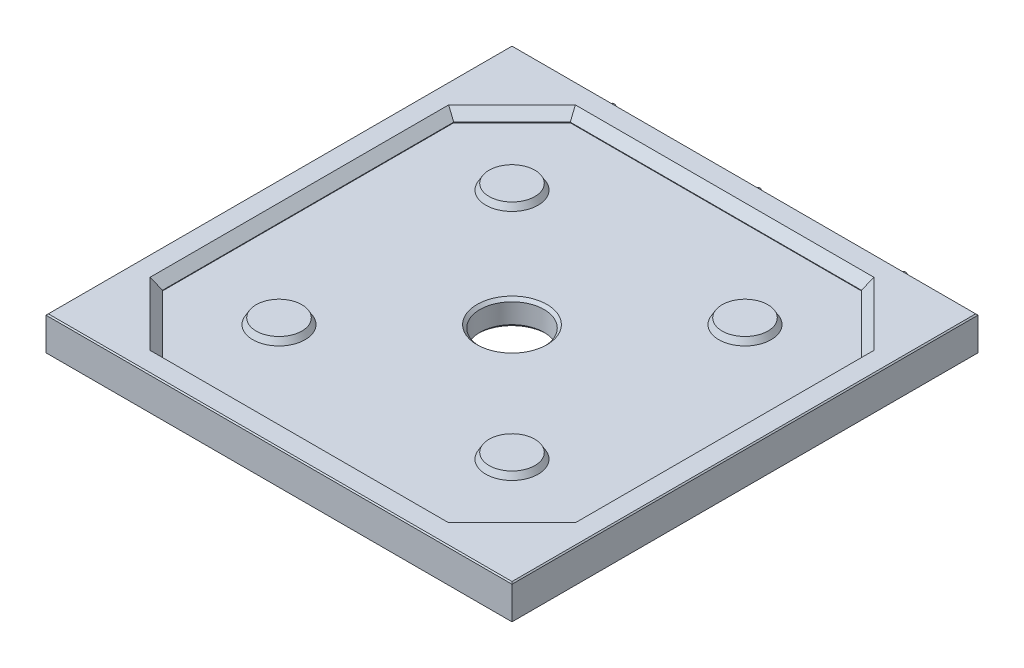
ISO-10303-21;
HEADER;
FILE_DESCRIPTION(('STEP AP214'),'2;1');
FILE_NAME('part.step','',(''),(''),'','','');
FILE_SCHEMA(('AUTOMOTIVE_DESIGN { 1 0 10303 214 1 1 1 1 }'));
ENDSEC;
DATA;
#1=APPLICATION_CONTEXT('core data for automotive mechanical design processes');
#2=APPLICATION_PROTOCOL_DEFINITION('international standard','automotive_design',2000,#1);
#3=PRODUCT_CONTEXT('',#1,'mechanical');
#4=PRODUCT('Part','Part','',(#3));
#5=PRODUCT_RELATED_PRODUCT_CATEGORY('part','',(#4));
#6=PRODUCT_DEFINITION_FORMATION('','',#4);
#7=PRODUCT_DEFINITION_CONTEXT('part definition',#1,'design');
#8=PRODUCT_DEFINITION('design','',#6,#7);
#9=PRODUCT_DEFINITION_SHAPE('','',#8);
#10=(LENGTH_UNIT() NAMED_UNIT(*) SI_UNIT(.MILLI.,.METRE.));
#11=(NAMED_UNIT(*) PLANE_ANGLE_UNIT() SI_UNIT($,.RADIAN.));
#12=(NAMED_UNIT(*) SI_UNIT($,.STERADIAN.) SOLID_ANGLE_UNIT());
#13=UNCERTAINTY_MEASURE_WITH_UNIT(LENGTH_MEASURE(1.E-05),#10,'distance_accuracy_value','');
#14=(GEOMETRIC_REPRESENTATION_CONTEXT(3) GLOBAL_UNCERTAINTY_ASSIGNED_CONTEXT((#13)) GLOBAL_UNIT_ASSIGNED_CONTEXT((#10,
#11,#12)) REPRESENTATION_CONTEXT('',''));
#15=CARTESIAN_POINT('',(0.,0.,0.));
#16=DIRECTION('',(0.,0.,1.));
#17=DIRECTION('',(1.,0.,0.));
#18=AXIS2_PLACEMENT_3D('',#15,#16,#17);
#19=CARTESIAN_POINT('',(-200.,54.,200.));
#20=DIRECTION('',(0.,1.,0.));
#21=DIRECTION('',(0.,0.,1.));
#22=AXIS2_PLACEMENT_3D('',#19,#20,#21);
#23=PLANE('',#22);
#24=CARTESIAN_POINT('',(-200.,54.,200.));
#25=DIRECTION('',(0.,-1.,0.));
#26=DIRECTION('',(0.,0.,-1.));
#27=AXIS2_PLACEMENT_3D('',#24,#25,#26);
#28=CIRCLE('',#27,39.2264973081037);
#29=CARTESIAN_POINT('',(-200.,54.,160.773502691896));
#30=VERTEX_POINT('',#29);
#31=EDGE_CURVE('E20',#30,#30,#28,.T.);
#32=ORIENTED_EDGE('',*,*,#31,.F.);
#33=EDGE_LOOP('',(#32));
#34=FACE_BOUND('',#33,.T.);
#35=ADVANCED_FACE('F17',(#34),#23,.T.);
#36=CARTESIAN_POINT('',(200.,54.,200.));
#37=DIRECTION('',(0.,1.,0.));
#38=DIRECTION('',(0.,0.,1.));
#39=AXIS2_PLACEMENT_3D('',#36,#37,#38);
#40=PLANE('',#39);
#41=CARTESIAN_POINT('',(200.,54.,200.));
#42=DIRECTION('',(0.,-1.,0.));
#43=DIRECTION('',(0.,0.,-1.));
#44=AXIS2_PLACEMENT_3D('',#41,#42,#43);
#45=CIRCLE('',#44,39.2264973081037);
#46=CARTESIAN_POINT('',(200.,54.,160.773502691896));
#47=VERTEX_POINT('',#46);
#48=EDGE_CURVE('E259',#47,#47,#45,.T.);
#49=ORIENTED_EDGE('',*,*,#48,.F.);
#50=EDGE_LOOP('',(#49));
#51=FACE_BOUND('',#50,.T.);
#52=ADVANCED_FACE('F270',(#51),#40,.T.);
#53=CARTESIAN_POINT('',(200.,54.,-200.));
#54=DIRECTION('',(0.,1.,0.));
#55=DIRECTION('',(0.,0.,1.));
#56=AXIS2_PLACEMENT_3D('',#53,#54,#55);
#57=PLANE('',#56);
#58=CARTESIAN_POINT('',(200.,54.,-200.));
#59=DIRECTION('',(0.,-1.,0.));
#60=DIRECTION('',(0.,0.,-1.));
#61=AXIS2_PLACEMENT_3D('',#58,#59,#60);
#62=CIRCLE('',#61,39.2264973081037);
#63=CARTESIAN_POINT('',(200.,54.,-239.226497308104));
#64=VERTEX_POINT('',#63);
#65=EDGE_CURVE('E257',#64,#64,#62,.T.);
#66=ORIENTED_EDGE('',*,*,#65,.F.);
#67=EDGE_LOOP('',(#66));
#68=FACE_BOUND('',#67,.T.);
#69=ADVANCED_FACE('F275',(#68),#57,.T.);
#70=CARTESIAN_POINT('',(-200.,54.,-200.));
#71=DIRECTION('',(0.,1.,0.));
#72=DIRECTION('',(0.,0.,1.));
#73=AXIS2_PLACEMENT_3D('',#70,#71,#72);
#74=PLANE('',#73);
#75=CARTESIAN_POINT('',(-200.,54.,-200.));
#76=DIRECTION('',(0.,-1.,0.));
#77=DIRECTION('',(0.,0.,-1.));
#78=AXIS2_PLACEMENT_3D('',#75,#76,#77);
#79=CIRCLE('',#78,39.2264973081037);
#80=CARTESIAN_POINT('',(-200.,54.,-239.226497308104));
#81=VERTEX_POINT('',#80);
#82=EDGE_CURVE('E163',#81,#81,#79,.T.);
#83=ORIENTED_EDGE('',*,*,#82,.F.);
#84=EDGE_LOOP('',(#83));
#85=FACE_BOUND('',#84,.T.);
#86=ADVANCED_FACE('F446',(#85),#74,.T.);
#87=CARTESIAN_POINT('',(-200.,44.,200.));
#88=DIRECTION('',(0.,-1.,0.));
#89=DIRECTION('',(0.,0.,-1.));
#90=AXIS2_PLACEMENT_3D('',#87,#88,#89);
#91=CONICAL_SURFACE('',#90,45.,0.523598775598298);
#92=ORIENTED_EDGE('',*,*,#31,.T.);
#93=EDGE_LOOP('',(#92));
#94=FACE_BOUND('',#93,.T.);
#95=CARTESIAN_POINT('',(-200.,44.,200.));
#96=DIRECTION('',(0.,-1.,0.));
#97=DIRECTION('',(0.,0.,-1.));
#98=AXIS2_PLACEMENT_3D('',#95,#96,#97);
#99=CIRCLE('',#98,45.);
#100=CARTESIAN_POINT('',(-200.,44.,155.));
#101=VERTEX_POINT('',#100);
#102=EDGE_CURVE('E251',#101,#101,#99,.F.);
#103=ORIENTED_EDGE('',*,*,#102,.T.);
#104=EDGE_LOOP('',(#103));
#105=FACE_BOUND('',#104,.T.);
#106=ADVANCED_FACE('F266',(#94,#105),#91,.T.);
#107=CARTESIAN_POINT('',(200.,44.,200.));
#108=DIRECTION('',(0.,-1.,0.));
#109=DIRECTION('',(0.,0.,-1.));
#110=AXIS2_PLACEMENT_3D('',#107,#108,#109);
#111=CONICAL_SURFACE('',#110,45.,0.5235987755983);
#112=ORIENTED_EDGE('',*,*,#48,.T.);
#113=EDGE_LOOP('',(#112));
#114=FACE_BOUND('',#113,.T.);
#115=CARTESIAN_POINT('',(200.,44.,200.));
#116=DIRECTION('',(0.,-1.,0.));
#117=DIRECTION('',(0.,0.,-1.));
#118=AXIS2_PLACEMENT_3D('',#115,#116,#117);
#119=CIRCLE('',#118,45.);
#120=CARTESIAN_POINT('',(200.,44.,155.));
#121=VERTEX_POINT('',#120);
#122=EDGE_CURVE('E248',#121,#121,#119,.F.);
#123=ORIENTED_EDGE('',*,*,#122,.T.);
#124=EDGE_LOOP('',(#123));
#125=FACE_BOUND('',#124,.T.);
#126=ADVANCED_FACE('F440',(#114,#125),#111,.T.);
#127=CARTESIAN_POINT('',(200.,44.,-200.));
#128=DIRECTION('',(0.,-1.,0.));
#129=DIRECTION('',(0.,0.,-1.));
#130=AXIS2_PLACEMENT_3D('',#127,#128,#129);
#131=CONICAL_SURFACE('',#130,45.,0.5235987755983);
#132=ORIENTED_EDGE('',*,*,#65,.T.);
#133=EDGE_LOOP('',(#132));
#134=FACE_BOUND('',#133,.T.);
#135=CARTESIAN_POINT('',(200.,44.,-200.));
#136=DIRECTION('',(0.,-1.,0.));
#137=DIRECTION('',(0.,0.,-1.));
#138=AXIS2_PLACEMENT_3D('',#135,#136,#137);
#139=CIRCLE('',#138,45.);
#140=CARTESIAN_POINT('',(200.,44.,-245.));
#141=VERTEX_POINT('',#140);
#142=EDGE_CURVE('E245',#141,#141,#139,.F.);
#143=ORIENTED_EDGE('',*,*,#142,.T.);
#144=EDGE_LOOP('',(#143));
#145=FACE_BOUND('',#144,.T.);
#146=ADVANCED_FACE('F436',(#134,#145),#131,.T.);
#147=CARTESIAN_POINT('',(-200.,44.,-200.));
#148=DIRECTION('',(0.,-1.,0.));
#149=DIRECTION('',(0.,0.,-1.));
#150=AXIS2_PLACEMENT_3D('',#147,#148,#149);
#151=CONICAL_SURFACE('',#150,45.,0.523598775598298);
#152=ORIENTED_EDGE('',*,*,#82,.T.);
#153=EDGE_LOOP('',(#152));
#154=FACE_BOUND('',#153,.T.);
#155=CARTESIAN_POINT('',(-200.,44.,-200.));
#156=DIRECTION('',(0.,-1.,0.));
#157=DIRECTION('',(0.,0.,-1.));
#158=AXIS2_PLACEMENT_3D('',#155,#156,#157);
#159=CIRCLE('',#158,45.);
#160=CARTESIAN_POINT('',(-200.,44.,-245.));
#161=VERTEX_POINT('',#160);
#162=EDGE_CURVE('E242',#161,#161,#159,.F.);
#163=ORIENTED_EDGE('',*,*,#162,.T.);
#164=EDGE_LOOP('',(#163));
#165=FACE_BOUND('',#164,.T.);
#166=ADVANCED_FACE('F433',(#154,#165),#151,.T.);
#167=CARTESIAN_POINT('',(-250.,44.,-350.));
#168=DIRECTION('',(0.,0.,-1.));
#169=DIRECTION('',(-1.,0.,0.));
#170=AXIS2_PLACEMENT_3D('',#167,#168,#169);
#171=PLANE('',#170);
#172=DIRECTION('',(1.,0.,0.));
#173=VECTOR('',#172,1.);
#174=CARTESIAN_POINT('',(-250.,45.,-350.));
#175=LINE('',#174,#173);
#176=CARTESIAN_POINT('',(250.,45.,-350.));
#177=VERTEX_POINT('',#176);
#178=CARTESIAN_POINT('',(-250.,45.,-350.));
#179=VERTEX_POINT('',#178);
#180=EDGE_CURVE('E152',#177,#179,#175,.F.);
#181=ORIENTED_EDGE('',*,*,#180,.T.);
#182=DIRECTION('',(0.,1.,0.));
#183=VECTOR('',#182,1.);
#184=CARTESIAN_POINT('',(-250.,44.,-350.));
#185=LINE('',#184,#183);
#186=CARTESIAN_POINT('',(-250.,44.,-350.));
#187=VERTEX_POINT('',#186);
#188=EDGE_CURVE('E174',#179,#187,#185,.F.);
#189=ORIENTED_EDGE('',*,*,#188,.T.);
#190=DIRECTION('',(1.,0.,0.));
#191=VECTOR('',#190,1.);
#192=CARTESIAN_POINT('',(-2.4980018054066E-13,44.,-350.));
#193=LINE('',#192,#191);
#194=CARTESIAN_POINT('',(250.,44.,-350.));
#195=VERTEX_POINT('',#194);
#196=EDGE_CURVE('E159',#187,#195,#193,.T.);
#197=ORIENTED_EDGE('',*,*,#196,.T.);
#198=DIRECTION('',(0.,1.,0.));
#199=VECTOR('',#198,1.);
#200=CARTESIAN_POINT('',(250.,44.,-350.));
#201=LINE('',#200,#199);
#202=EDGE_CURVE('E155',#195,#177,#201,.T.);
#203=ORIENTED_EDGE('',*,*,#202,.T.);
#204=EDGE_LOOP('',(#181,#189,#197,#203));
#205=FACE_BOUND('',#204,.T.);
#206=ADVANCED_FACE('F157',(#205),#171,.F.);
#207=CARTESIAN_POINT('',(250.,44.,-350.));
#208=DIRECTION('',(0.707106781186547,0.,-0.707106781186548));
#209=DIRECTION('',(-0.707106781186548,0.,-0.707106781186547));
#210=AXIS2_PLACEMENT_3D('',#207,#208,#209);
#211=PLANE('',#210);
#212=DIRECTION('',(-0.707106781186547,0.,-0.707106781186548));
#213=VECTOR('',#212,1.);
#214=CARTESIAN_POINT('',(350.,45.,-250.));
#215=LINE('',#214,#213);
#216=CARTESIAN_POINT('',(350.,45.,-250.));
#217=VERTEX_POINT('',#216);
#218=EDGE_CURVE('E166',#217,#177,#215,.T.);
#219=ORIENTED_EDGE('',*,*,#218,.T.);
#220=ORIENTED_EDGE('',*,*,#202,.F.);
#221=DIRECTION('',(0.707106781186547,0.,0.707106781186548));
#222=VECTOR('',#221,1.);
#223=CARTESIAN_POINT('',(250.,44.,-350.));
#224=LINE('',#223,#222);
#225=CARTESIAN_POINT('',(350.,44.,-250.));
#226=VERTEX_POINT('',#225);
#227=EDGE_CURVE('E758',#195,#226,#224,.T.);
#228=ORIENTED_EDGE('',*,*,#227,.T.);
#229=DIRECTION('',(0.,1.,0.));
#230=VECTOR('',#229,1.);
#231=CARTESIAN_POINT('',(350.,44.,-250.));
#232=LINE('',#231,#230);
#233=EDGE_CURVE('E162',#226,#217,#232,.T.);
#234=ORIENTED_EDGE('',*,*,#233,.T.);
#235=EDGE_LOOP('',(#219,#220,#228,#234));
#236=FACE_BOUND('',#235,.T.);
#237=ADVANCED_FACE('F168',(#236),#211,.F.);
#238=CARTESIAN_POINT('',(350.,44.,-250.));
#239=DIRECTION('',(1.,0.,0.));
#240=DIRECTION('',(0.,0.,-1.));
#241=AXIS2_PLACEMENT_3D('',#238,#239,#240);
#242=PLANE('',#241);
#243=DIRECTION('',(0.,0.,1.));
#244=VECTOR('',#243,1.);
#245=CARTESIAN_POINT('',(350.,45.,-250.));
#246=LINE('',#245,#244);
#247=CARTESIAN_POINT('',(350.,45.,250.));
#248=VERTEX_POINT('',#247);
#249=EDGE_CURVE('E696',#248,#217,#246,.F.);
#250=ORIENTED_EDGE('',*,*,#249,.T.);
#251=ORIENTED_EDGE('',*,*,#233,.F.);
#252=DIRECTION('',(0.,0.,-1.));
#253=VECTOR('',#252,1.);
#254=CARTESIAN_POINT('',(350.,44.,-600.));
#255=LINE('',#254,#253);
#256=CARTESIAN_POINT('',(350.,44.,250.));
#257=VERTEX_POINT('',#256);
#258=EDGE_CURVE('E756',#226,#257,#255,.F.);
#259=ORIENTED_EDGE('',*,*,#258,.T.);
#260=DIRECTION('',(0.,1.,0.));
#261=VECTOR('',#260,1.);
#262=CARTESIAN_POINT('',(350.,44.,250.));
#263=LINE('',#262,#261);
#264=EDGE_CURVE('E203',#257,#248,#263,.T.);
#265=ORIENTED_EDGE('',*,*,#264,.T.);
#266=EDGE_LOOP('',(#250,#251,#259,#265));
#267=FACE_BOUND('',#266,.T.);
#268=ADVANCED_FACE('F424',(#267),#242,.F.);
#269=CARTESIAN_POINT('',(250.,44.,350.));
#270=DIRECTION('',(0.707106781186548,0.,0.707106781186547));
#271=DIRECTION('',(0.707106781186547,0.,-0.707106781186548));
#272=AXIS2_PLACEMENT_3D('',#269,#270,#271);
#273=PLANE('',#272);
#274=DIRECTION('',(0.707106781186547,0.,-0.707106781186548));
#275=VECTOR('',#274,1.);
#276=CARTESIAN_POINT('',(250.,45.,350.));
#277=LINE('',#276,#275);
#278=CARTESIAN_POINT('',(250.,45.,350.));
#279=VERTEX_POINT('',#278);
#280=EDGE_CURVE('E711',#279,#248,#277,.T.);
#281=ORIENTED_EDGE('',*,*,#280,.T.);
#282=ORIENTED_EDGE('',*,*,#264,.F.);
#283=DIRECTION('',(-0.707106781186547,0.,0.707106781186548));
#284=VECTOR('',#283,1.);
#285=CARTESIAN_POINT('',(350.,44.,250.));
#286=LINE('',#285,#284);
#287=CARTESIAN_POINT('',(250.,44.,350.));
#288=VERTEX_POINT('',#287);
#289=EDGE_CURVE('E751',#257,#288,#286,.T.);
#290=ORIENTED_EDGE('',*,*,#289,.T.);
#291=DIRECTION('',(0.,1.,0.));
#292=VECTOR('',#291,1.);
#293=CARTESIAN_POINT('',(250.,44.,350.));
#294=LINE('',#293,#292);
#295=EDGE_CURVE('E201',#288,#279,#294,.T.);
#296=ORIENTED_EDGE('',*,*,#295,.T.);
#297=EDGE_LOOP('',(#281,#282,#290,#296));
#298=FACE_BOUND('',#297,.T.);
#299=ADVANCED_FACE('F420',(#298),#273,.F.);
#300=CARTESIAN_POINT('',(-250.,44.,350.));
#301=DIRECTION('',(0.,0.,1.));
#302=DIRECTION('',(1.,0.,0.));
#303=AXIS2_PLACEMENT_3D('',#300,#301,#302);
#304=PLANE('',#303);
#305=DIRECTION('',(1.,0.,0.));
#306=VECTOR('',#305,1.);
#307=CARTESIAN_POINT('',(-250.,45.,350.));
#308=LINE('',#307,#306);
#309=CARTESIAN_POINT('',(-250.,45.,350.));
#310=VERTEX_POINT('',#309);
#311=EDGE_CURVE('E716',#310,#279,#308,.T.);
#312=ORIENTED_EDGE('',*,*,#311,.T.);
#313=ORIENTED_EDGE('',*,*,#295,.F.);
#314=DIRECTION('',(1.,0.,0.));
#315=VECTOR('',#314,1.);
#316=CARTESIAN_POINT('',(-2.4980018054066E-13,44.,350.));
#317=LINE('',#316,#315);
#318=CARTESIAN_POINT('',(-250.,44.,350.));
#319=VERTEX_POINT('',#318);
#320=EDGE_CURVE('E747',#288,#319,#317,.F.);
#321=ORIENTED_EDGE('',*,*,#320,.T.);
#322=DIRECTION('',(0.,1.,0.));
#323=VECTOR('',#322,1.);
#324=CARTESIAN_POINT('',(-250.,44.,350.));
#325=LINE('',#324,#323);
#326=EDGE_CURVE('E199',#319,#310,#325,.T.);
#327=ORIENTED_EDGE('',*,*,#326,.T.);
#328=EDGE_LOOP('',(#312,#313,#321,#327));
#329=FACE_BOUND('',#328,.T.);
#330=ADVANCED_FACE('F416',(#329),#304,.F.);
#331=CARTESIAN_POINT('',(-350.,44.,250.));
#332=DIRECTION('',(-0.707106781186548,0.,0.707106781186548));
#333=DIRECTION('',(0.707106781186548,0.,0.707106781186548));
#334=AXIS2_PLACEMENT_3D('',#331,#332,#333);
#335=PLANE('',#334);
#336=DIRECTION('',(0.707106781186547,0.,0.707106781186547));
#337=VECTOR('',#336,1.);
#338=CARTESIAN_POINT('',(-350.,45.,250.));
#339=LINE('',#338,#337);
#340=CARTESIAN_POINT('',(-350.,45.,250.));
#341=VERTEX_POINT('',#340);
#342=EDGE_CURVE('E722',#341,#310,#339,.T.);
#343=ORIENTED_EDGE('',*,*,#342,.T.);
#344=ORIENTED_EDGE('',*,*,#326,.F.);
#345=DIRECTION('',(-0.707106781186547,0.,-0.707106781186547));
#346=VECTOR('',#345,1.);
#347=CARTESIAN_POINT('',(-250.,44.,350.));
#348=LINE('',#347,#346);
#349=CARTESIAN_POINT('',(-350.,44.,250.));
#350=VERTEX_POINT('',#349);
#351=EDGE_CURVE('E744',#319,#350,#348,.T.);
#352=ORIENTED_EDGE('',*,*,#351,.T.);
#353=DIRECTION('',(0.,1.,0.));
#354=VECTOR('',#353,1.);
#355=CARTESIAN_POINT('',(-350.,44.,250.));
#356=LINE('',#355,#354);
#357=EDGE_CURVE('E197',#350,#341,#356,.T.);
#358=ORIENTED_EDGE('',*,*,#357,.T.);
#359=EDGE_LOOP('',(#343,#344,#352,#358));
#360=FACE_BOUND('',#359,.T.);
#361=ADVANCED_FACE('F412',(#360),#335,.F.);
#362=CARTESIAN_POINT('',(-350.,44.,-250.));
#363=DIRECTION('',(-1.,0.,0.));
#364=DIRECTION('',(0.,0.,1.));
#365=AXIS2_PLACEMENT_3D('',#362,#363,#364);
#366=PLANE('',#365);
#367=DIRECTION('',(0.,0.,1.));
#368=VECTOR('',#367,1.);
#369=CARTESIAN_POINT('',(-350.,45.,-250.));
#370=LINE('',#369,#368);
#371=CARTESIAN_POINT('',(-350.,45.,-250.));
#372=VERTEX_POINT('',#371);
#373=EDGE_CURVE('E728',#372,#341,#370,.T.);
#374=ORIENTED_EDGE('',*,*,#373,.T.);
#375=ORIENTED_EDGE('',*,*,#357,.F.);
#376=DIRECTION('',(0.,0.,-1.));
#377=VECTOR('',#376,1.);
#378=CARTESIAN_POINT('',(-350.,44.,-600.));
#379=LINE('',#378,#377);
#380=CARTESIAN_POINT('',(-350.,44.,-250.));
#381=VERTEX_POINT('',#380);
#382=EDGE_CURVE('E746',#350,#381,#379,.T.);
#383=ORIENTED_EDGE('',*,*,#382,.T.);
#384=DIRECTION('',(0.,1.,0.));
#385=VECTOR('',#384,1.);
#386=CARTESIAN_POINT('',(-350.,44.,-250.));
#387=LINE('',#386,#385);
#388=EDGE_CURVE('E195',#381,#372,#387,.T.);
#389=ORIENTED_EDGE('',*,*,#388,.T.);
#390=EDGE_LOOP('',(#374,#375,#383,#389));
#391=FACE_BOUND('',#390,.T.);
#392=ADVANCED_FACE('F408',(#391),#366,.F.);
#393=CARTESIAN_POINT('',(-350.,44.,-250.));
#394=DIRECTION('',(-0.707106781186548,0.,-0.707106781186548));
#395=DIRECTION('',(-0.707106781186548,0.,0.707106781186548));
#396=AXIS2_PLACEMENT_3D('',#393,#394,#395);
#397=PLANE('',#396);
#398=DIRECTION('',(-0.707106781186548,0.,0.707106781186547));
#399=VECTOR('',#398,1.);
#400=CARTESIAN_POINT('',(-250.,45.,-350.));
#401=LINE('',#400,#399);
#402=EDGE_CURVE('E188',#179,#372,#401,.T.);
#403=ORIENTED_EDGE('',*,*,#402,.T.);
#404=ORIENTED_EDGE('',*,*,#388,.F.);
#405=DIRECTION('',(0.707106781186547,0.,-0.707106781186548));
#406=VECTOR('',#405,1.);
#407=CARTESIAN_POINT('',(-350.,44.,-250.));
#408=LINE('',#407,#406);
#409=EDGE_CURVE('E749',#381,#187,#408,.T.);
#410=ORIENTED_EDGE('',*,*,#409,.T.);
#411=ORIENTED_EDGE('',*,*,#188,.F.);
#412=EDGE_LOOP('',(#403,#404,#410,#411));
#413=FACE_BOUND('',#412,.T.);
#414=ADVANCED_FACE('F405',(#413),#397,.F.);
#415=CARTESIAN_POINT('',(250.,45.,-350.));
#416=DIRECTION('',(0.499999999999998,-0.707106781186551,-0.499999999999998));
#417=DIRECTION('',(0.,0.577350269189622,-0.816496580927728));
#418=AXIS2_PLACEMENT_3D('',#415,#416,#417);
#419=PLANE('',#418);
#420=ORIENTED_EDGE('',*,*,#218,.F.);
#421=DIRECTION('',(0.678598344545849,0.678598344545844,-0.281084637714822));
#422=VECTOR('',#421,1.);
#423=CARTESIAN_POINT('',(350.,45.,-250.));
#424=LINE('',#423,#422);
#425=CARTESIAN_POINT('',(365.,60.,-256.213203435596));
#426=VERTEX_POINT('',#425);
#427=EDGE_CURVE('E254',#217,#426,#424,.T.);
#428=ORIENTED_EDGE('',*,*,#427,.T.);
#429=DIRECTION('',(-0.707106781186547,0.,-0.707106781186548));
#430=VECTOR('',#429,1.);
#431=CARTESIAN_POINT('',(365.,60.,-256.213203435596));
#432=LINE('',#431,#430);
#433=CARTESIAN_POINT('',(256.213203435596,60.,-365.));
#434=VERTEX_POINT('',#433);
#435=EDGE_CURVE('E179',#426,#434,#432,.T.);
#436=ORIENTED_EDGE('',*,*,#435,.T.);
#437=DIRECTION('',(-0.281084637714822,-0.678598344545844,0.678598344545849));
#438=VECTOR('',#437,1.);
#439=CARTESIAN_POINT('',(256.213203435596,60.,-365.));
#440=LINE('',#439,#438);
#441=EDGE_CURVE('E173',#434,#177,#440,.T.);
#442=ORIENTED_EDGE('',*,*,#441,.T.);
#443=EDGE_LOOP('',(#420,#428,#436,#442));
#444=FACE_BOUND('',#443,.T.);
#445=ADVANCED_FACE('F177',(#444),#419,.F.);
#446=CARTESIAN_POINT('',(-250.,45.,-350.));
#447=DIRECTION('',(0.,-0.70710678118655,-0.707106781186545));
#448=DIRECTION('',(0.,0.707106781186545,-0.70710678118655));
#449=AXIS2_PLACEMENT_3D('',#446,#447,#448);
#450=PLANE('',#449);
#451=ORIENTED_EDGE('',*,*,#180,.F.);
#452=ORIENTED_EDGE('',*,*,#441,.F.);
#453=DIRECTION('',(1.,0.,0.));
#454=VECTOR('',#453,1.);
#455=CARTESIAN_POINT('',(-400.,60.,-365.));
#456=LINE('',#455,#454);
#457=CARTESIAN_POINT('',(-256.213203435597,60.,-365.));
#458=VERTEX_POINT('',#457);
#459=EDGE_CURVE('E783',#434,#458,#456,.F.);
#460=ORIENTED_EDGE('',*,*,#459,.T.);
#461=DIRECTION('',(0.281084637714827,-0.678598344545843,0.678598344545848));
#462=VECTOR('',#461,1.);
#463=CARTESIAN_POINT('',(-256.213203435597,60.,-365.));
#464=LINE('',#463,#462);
#465=EDGE_CURVE('E186',#458,#179,#464,.T.);
#466=ORIENTED_EDGE('',*,*,#465,.T.);
#467=EDGE_LOOP('',(#451,#452,#460,#466));
#468=FACE_BOUND('',#467,.T.);
#469=ADVANCED_FACE('F184',(#468),#450,.F.);
#470=CARTESIAN_POINT('',(-350.,45.,-250.));
#471=DIRECTION('',(-0.499999999999997,-0.707106781186552,-0.499999999999997));
#472=DIRECTION('',(0.,0.577350269189621,-0.816496580927729));
#473=AXIS2_PLACEMENT_3D('',#470,#471,#472);
#474=PLANE('',#473);
#475=DIRECTION('',(-0.707106781186548,0.,0.707106781186548));
#476=VECTOR('',#475,1.);
#477=CARTESIAN_POINT('',(-256.213203435597,60.,-365.));
#478=LINE('',#477,#476);
#479=CARTESIAN_POINT('',(-365.,60.,-256.213203435597));
#480=VERTEX_POINT('',#479);
#481=EDGE_CURVE('E781',#458,#480,#478,.T.);
#482=ORIENTED_EDGE('',*,*,#481,.T.);
#483=DIRECTION('',(0.678598344545847,-0.678598344545844,0.281084637714828));
#484=VECTOR('',#483,1.);
#485=CARTESIAN_POINT('',(-365.,60.,-256.213203435597));
#486=LINE('',#485,#484);
#487=EDGE_CURVE('E725',#480,#372,#486,.T.);
#488=ORIENTED_EDGE('',*,*,#487,.T.);
#489=ORIENTED_EDGE('',*,*,#402,.F.);
#490=ORIENTED_EDGE('',*,*,#465,.F.);
#491=EDGE_LOOP('',(#482,#488,#489,#490));
#492=FACE_BOUND('',#491,.T.);
#493=ADVANCED_FACE('F396',(#492),#474,.F.);
#494=CARTESIAN_POINT('',(-350.,45.,-250.));
#495=DIRECTION('',(-0.707106781186545,-0.70710678118655,0.));
#496=DIRECTION('',(0.70710678118655,-0.707106781186545,0.));
#497=AXIS2_PLACEMENT_3D('',#494,#495,#496);
#498=PLANE('',#497);
#499=DIRECTION('',(0.,0.,-1.));
#500=VECTOR('',#499,1.);
#501=CARTESIAN_POINT('',(-365.,60.,-400.));
#502=LINE('',#501,#500);
#503=CARTESIAN_POINT('',(-365.,60.,256.213203435596));
#504=VERTEX_POINT('',#503);
#505=EDGE_CURVE('E738',#480,#504,#502,.F.);
#506=ORIENTED_EDGE('',*,*,#505,.T.);
#507=DIRECTION('',(0.678598344545848,-0.678598344545845,-0.281084637714823));
#508=VECTOR('',#507,1.);
#509=CARTESIAN_POINT('',(-365.,60.,256.213203435596));
#510=LINE('',#509,#508);
#511=EDGE_CURVE('E719',#504,#341,#510,.T.);
#512=ORIENTED_EDGE('',*,*,#511,.T.);
#513=ORIENTED_EDGE('',*,*,#373,.F.);
#514=ORIENTED_EDGE('',*,*,#487,.F.);
#515=EDGE_LOOP('',(#506,#512,#513,#514));
#516=FACE_BOUND('',#515,.T.);
#517=ADVANCED_FACE('F392',(#516),#498,.F.);
#518=CARTESIAN_POINT('',(-350.,45.,250.));
#519=DIRECTION('',(-0.499999999999998,-0.707106781186551,0.499999999999998));
#520=DIRECTION('',(0.,-0.577350269189622,-0.816496580927728));
#521=AXIS2_PLACEMENT_3D('',#518,#519,#520);
#522=PLANE('',#521);
#523=DIRECTION('',(0.707106781186547,0.,0.707106781186547));
#524=VECTOR('',#523,1.);
#525=CARTESIAN_POINT('',(-365.,60.,256.213203435596));
#526=LINE('',#525,#524);
#527=CARTESIAN_POINT('',(-256.213203435597,60.,365.));
#528=VERTEX_POINT('',#527);
#529=EDGE_CURVE('E778',#504,#528,#526,.T.);
#530=ORIENTED_EDGE('',*,*,#529,.T.);
#531=DIRECTION('',(0.281084637714825,-0.678598344545844,-0.678598344545848));
#532=VECTOR('',#531,1.);
#533=CARTESIAN_POINT('',(-256.213203435597,60.,365.));
#534=LINE('',#533,#532);
#535=EDGE_CURVE('E713',#528,#310,#534,.T.);
#536=ORIENTED_EDGE('',*,*,#535,.T.);
#537=ORIENTED_EDGE('',*,*,#342,.F.);
#538=ORIENTED_EDGE('',*,*,#511,.F.);
#539=EDGE_LOOP('',(#530,#536,#537,#538));
#540=FACE_BOUND('',#539,.T.);
#541=ADVANCED_FACE('F388',(#540),#522,.F.);
#542=CARTESIAN_POINT('',(-250.,45.,350.));
#543=DIRECTION('',(0.,-0.707106781186549,0.707106781186546));
#544=DIRECTION('',(0.,-0.707106781186546,-0.707106781186549));
#545=AXIS2_PLACEMENT_3D('',#542,#543,#544);
#546=PLANE('',#545);
#547=DIRECTION('',(1.,0.,0.));
#548=VECTOR('',#547,1.);
#549=CARTESIAN_POINT('',(-400.,60.,365.));
#550=LINE('',#549,#548);
#551=CARTESIAN_POINT('',(256.213203435597,60.,365.));
#552=VERTEX_POINT('',#551);
#553=EDGE_CURVE('E771',#528,#552,#550,.T.);
#554=ORIENTED_EDGE('',*,*,#553,.T.);
#555=DIRECTION('',(-0.281084637714836,-0.678598344545843,-0.678598344545844));
#556=VECTOR('',#555,1.);
#557=CARTESIAN_POINT('',(256.213203435597,60.,365.));
#558=LINE('',#557,#556);
#559=EDGE_CURVE('E705',#552,#279,#558,.T.);
#560=ORIENTED_EDGE('',*,*,#559,.T.);
#561=ORIENTED_EDGE('',*,*,#311,.F.);
#562=ORIENTED_EDGE('',*,*,#535,.F.);
#563=EDGE_LOOP('',(#554,#560,#561,#562));
#564=FACE_BOUND('',#563,.T.);
#565=ADVANCED_FACE('F384',(#564),#546,.F.);
#566=CARTESIAN_POINT('',(250.,45.,350.));
#567=DIRECTION('',(0.499999999999995,-0.707106781186555,0.499999999999995));
#568=DIRECTION('',(0.816496580927731,0.577350269189618,0.));
#569=AXIS2_PLACEMENT_3D('',#566,#567,#568);
#570=PLANE('',#569);
#571=DIRECTION('',(0.707106781186547,0.,-0.707106781186548));
#572=VECTOR('',#571,1.);
#573=CARTESIAN_POINT('',(256.213203435597,60.,365.));
#574=LINE('',#573,#572);
#575=CARTESIAN_POINT('',(365.,60.,256.213203435597));
#576=VERTEX_POINT('',#575);
#577=EDGE_CURVE('E765',#552,#576,#574,.T.);
#578=ORIENTED_EDGE('',*,*,#577,.T.);
#579=DIRECTION('',(-0.678598344545847,-0.678598344545842,-0.281084637714832));
#580=VECTOR('',#579,1.);
#581=CARTESIAN_POINT('',(365.,60.,256.213203435597));
#582=LINE('',#581,#580);
#583=EDGE_CURVE('E701',#576,#248,#582,.T.);
#584=ORIENTED_EDGE('',*,*,#583,.T.);
#585=ORIENTED_EDGE('',*,*,#280,.F.);
#586=ORIENTED_EDGE('',*,*,#559,.F.);
#587=EDGE_LOOP('',(#578,#584,#585,#586));
#588=FACE_BOUND('',#587,.T.);
#589=ADVANCED_FACE('F380',(#588),#570,.F.);
#590=CARTESIAN_POINT('',(350.,45.,-250.));
#591=DIRECTION('',(0.707106781186545,-0.70710678118655,0.));
#592=DIRECTION('',(0.70710678118655,0.707106781186545,0.));
#593=AXIS2_PLACEMENT_3D('',#590,#591,#592);
#594=PLANE('',#593);
#595=ORIENTED_EDGE('',*,*,#249,.F.);
#596=ORIENTED_EDGE('',*,*,#583,.F.);
#597=DIRECTION('',(0.,0.,-1.));
#598=VECTOR('',#597,1.);
#599=CARTESIAN_POINT('',(365.,60.,-400.));
#600=LINE('',#599,#598);
#601=EDGE_CURVE('E241',#576,#426,#600,.T.);
#602=ORIENTED_EDGE('',*,*,#601,.T.);
#603=ORIENTED_EDGE('',*,*,#427,.F.);
#604=EDGE_LOOP('',(#595,#596,#602,#603));
#605=FACE_BOUND('',#604,.T.);
#606=ADVANCED_FACE('F376',(#605),#594,.F.);
#607=CARTESIAN_POINT('',(-2.4980018054066E-13,44.,-600.));
#608=DIRECTION('',(0.,-1.,0.));
#609=DIRECTION('',(0.,0.,-1.));
#610=AXIS2_PLACEMENT_3D('',#607,#608,#609);
#611=PLANE('',#610);
#612=ORIENTED_EDGE('',*,*,#382,.F.);
#613=ORIENTED_EDGE('',*,*,#351,.F.);
#614=ORIENTED_EDGE('',*,*,#320,.F.);
#615=ORIENTED_EDGE('',*,*,#289,.F.);
#616=ORIENTED_EDGE('',*,*,#258,.F.);
#617=ORIENTED_EDGE('',*,*,#227,.F.);
#618=ORIENTED_EDGE('',*,*,#196,.F.);
#619=ORIENTED_EDGE('',*,*,#409,.F.);
#620=EDGE_LOOP('',(#612,#613,#614,#615,#616,#617,#618,#619));
#621=FACE_BOUND('',#620,.T.);
#622=ORIENTED_EDGE('',*,*,#162,.F.);
#623=EDGE_LOOP('',(#622));
#624=FACE_BOUND('',#623,.T.);
#625=ORIENTED_EDGE('',*,*,#142,.F.);
#626=EDGE_LOOP('',(#625));
#627=FACE_BOUND('',#626,.T.);
#628=ORIENTED_EDGE('',*,*,#122,.F.);
#629=EDGE_LOOP('',(#628));
#630=FACE_BOUND('',#629,.T.);
#631=ORIENTED_EDGE('',*,*,#102,.F.);
#632=EDGE_LOOP('',(#631));
#633=FACE_BOUND('',#632,.T.);
#634=CARTESIAN_POINT('',(0.,44.,0.));
#635=DIRECTION('',(0.,1.,0.));
#636=DIRECTION('',(0.,0.,1.));
#637=AXIS2_PLACEMENT_3D('',#634,#635,#636);
#638=CIRCLE('',#637,60.0000000000003);
#639=CARTESIAN_POINT('',(0.,44.,60.0000000000003));
#640=VERTEX_POINT('',#639);
#641=EDGE_CURVE('E237',#640,#640,#638,.F.);
#642=ORIENTED_EDGE('',*,*,#641,.T.);
#643=EDGE_LOOP('',(#642));
#644=FACE_BOUND('',#643,.T.);
#645=ADVANCED_FACE('F372',(#621,#624,#627,#630,#633,#644),#611,.F.);
#646=CARTESIAN_POINT('',(0.,30.,-425.));
#647=DIRECTION('',(0.,0.,-1.));
#648=DIRECTION('',(-1.,0.,0.));
#649=AXIS2_PLACEMENT_3D('',#646,#647,#648);
#650=PLANE('',#649);
#651=CARTESIAN_POINT('',(0.,30.,-425.));
#652=DIRECTION('',(0.,0.,1.));
#653=DIRECTION('',(1.,0.,0.));
#654=AXIS2_PLACEMENT_3D('',#651,#652,#653);
#655=CIRCLE('',#654,5.);
#656=CARTESIAN_POINT('',(5.,30.,-425.));
#657=VERTEX_POINT('',#656);
#658=EDGE_CURVE('E232',#657,#657,#655,.T.);
#659=ORIENTED_EDGE('',*,*,#658,.F.);
#660=EDGE_LOOP('',(#659));
#661=FACE_BOUND('',#660,.T.);
#662=ADVANCED_FACE('F368',(#661),#650,.T.);
#663=CARTESIAN_POINT('',(250.,30.,-425.));
#664=DIRECTION('',(0.,0.,-1.));
#665=DIRECTION('',(-1.,0.,0.));
#666=AXIS2_PLACEMENT_3D('',#663,#664,#665);
#667=PLANE('',#666);
#668=CARTESIAN_POINT('',(250.,30.,-425.));
#669=DIRECTION('',(0.,0.,1.));
#670=DIRECTION('',(1.,0.,0.));
#671=AXIS2_PLACEMENT_3D('',#668,#669,#670);
#672=CIRCLE('',#671,5.);
#673=CARTESIAN_POINT('',(255.,30.,-425.));
#674=VERTEX_POINT('',#673);
#675=EDGE_CURVE('E228',#674,#674,#672,.T.);
#676=ORIENTED_EDGE('',*,*,#675,.F.);
#677=EDGE_LOOP('',(#676));
#678=FACE_BOUND('',#677,.T.);
#679=ADVANCED_FACE('F364',(#678),#667,.T.);
#680=CARTESIAN_POINT('',(-250.,30.,-425.));
#681=DIRECTION('',(0.,0.,-1.));
#682=DIRECTION('',(-1.,0.,0.));
#683=AXIS2_PLACEMENT_3D('',#680,#681,#682);
#684=PLANE('',#683);
#685=CARTESIAN_POINT('',(-250.,30.,-425.));
#686=DIRECTION('',(0.,0.,1.));
#687=DIRECTION('',(1.,0.,0.));
#688=AXIS2_PLACEMENT_3D('',#685,#686,#687);
#689=CIRCLE('',#688,5.);
#690=CARTESIAN_POINT('',(-245.,30.,-425.));
#691=VERTEX_POINT('',#690);
#692=EDGE_CURVE('E224',#691,#691,#689,.T.);
#693=ORIENTED_EDGE('',*,*,#692,.F.);
#694=EDGE_LOOP('',(#693));
#695=FACE_BOUND('',#694,.T.);
#696=ADVANCED_FACE('F360',(#695),#684,.T.);
#697=CARTESIAN_POINT('',(-400.,60.,-400.));
#698=DIRECTION('',(0.,-1.,0.));
#699=DIRECTION('',(0.,0.,-1.));
#700=AXIS2_PLACEMENT_3D('',#697,#698,#699);
#701=PLANE('',#700);
#702=ORIENTED_EDGE('',*,*,#577,.F.);
#703=ORIENTED_EDGE('',*,*,#553,.F.);
#704=ORIENTED_EDGE('',*,*,#529,.F.);
#705=ORIENTED_EDGE('',*,*,#505,.F.);
#706=ORIENTED_EDGE('',*,*,#481,.F.);
#707=ORIENTED_EDGE('',*,*,#459,.F.);
#708=ORIENTED_EDGE('',*,*,#435,.F.);
#709=ORIENTED_EDGE('',*,*,#601,.F.);
#710=EDGE_LOOP('',(#702,#703,#704,#705,#706,#707,#708,#709));
#711=FACE_BOUND('',#710,.T.);
#712=DIRECTION('',(1.,0.,0.));
#713=VECTOR('',#712,1.);
#714=CARTESIAN_POINT('',(-400.,60.,-398.));
#715=LINE('',#714,#713);
#716=CARTESIAN_POINT('',(398.,60.,-398.));
#717=VERTEX_POINT('',#716);
#718=CARTESIAN_POINT('',(-398.,60.,-398.));
#719=VERTEX_POINT('',#718);
#720=EDGE_CURVE('E235',#717,#719,#715,.F.);
#721=ORIENTED_EDGE('',*,*,#720,.T.);
#722=DIRECTION('',(0.,0.,1.));
#723=VECTOR('',#722,1.);
#724=CARTESIAN_POINT('',(-398.,60.,-400.));
#725=LINE('',#724,#723);
#726=CARTESIAN_POINT('',(-398.,60.,398.));
#727=VERTEX_POINT('',#726);
#728=EDGE_CURVE('E791',#719,#727,#725,.T.);
#729=ORIENTED_EDGE('',*,*,#728,.T.);
#730=DIRECTION('',(1.,0.,0.));
#731=VECTOR('',#730,1.);
#732=CARTESIAN_POINT('',(-400.,60.,398.));
#733=LINE('',#732,#731);
#734=CARTESIAN_POINT('',(398.,60.,398.));
#735=VERTEX_POINT('',#734);
#736=EDGE_CURVE('E240',#727,#735,#733,.T.);
#737=ORIENTED_EDGE('',*,*,#736,.T.);
#738=DIRECTION('',(0.,0.,1.));
#739=VECTOR('',#738,1.);
#740=CARTESIAN_POINT('',(398.,60.,-400.));
#741=LINE('',#740,#739);
#742=EDGE_CURVE('E227',#735,#717,#741,.F.);
#743=ORIENTED_EDGE('',*,*,#742,.T.);
#744=EDGE_LOOP('',(#721,#729,#737,#743));
#745=FACE_BOUND('',#744,.T.);
#746=ADVANCED_FACE('F356',(#711,#745),#701,.F.);
#747=CARTESIAN_POINT('',(0.,44.,0.));
#748=DIRECTION('',(0.,1.,0.));
#749=DIRECTION('',(0.,0.,1.));
#750=AXIS2_PLACEMENT_3D('',#747,#748,#749);
#751=CONICAL_SURFACE('',#750,60.0000000000003,0.785398163397457);
#752=CARTESIAN_POINT('',(0.,38.9999999999998,0.));
#753=DIRECTION('',(0.,1.,0.));
#754=DIRECTION('',(0.,0.,1.));
#755=AXIS2_PLACEMENT_3D('',#752,#753,#754);
#756=CIRCLE('',#755,55.);
#757=CARTESIAN_POINT('',(0.,38.9999999999998,55.));
#758=VERTEX_POINT('',#757);
#759=EDGE_CURVE('E774',#758,#758,#756,.F.);
#760=ORIENTED_EDGE('',*,*,#759,.T.);
#761=EDGE_LOOP('',(#760));
#762=FACE_BOUND('',#761,.T.);
#763=ORIENTED_EDGE('',*,*,#641,.F.);
#764=EDGE_LOOP('',(#763));
#765=FACE_BOUND('',#764,.T.);
#766=ADVANCED_FACE('F352',(#762,#765),#751,.F.);
#767=CARTESIAN_POINT('',(-400.,60.,398.));
#768=DIRECTION('',(0.,-0.707106781186548,-0.707106781186548));
#769=DIRECTION('',(0.,0.707106781186548,-0.707106781186548));
#770=AXIS2_PLACEMENT_3D('',#767,#768,#769);
#771=PLANE('',#770);
#772=DIRECTION('',(-1.,0.,0.));
#773=VECTOR('',#772,1.);
#774=CARTESIAN_POINT('',(-400.,58.0000000000001,400.));
#775=LINE('',#774,#773);
#776=CARTESIAN_POINT('',(-400.,58.0000000000001,400.));
#777=VERTEX_POINT('',#776);
#778=CARTESIAN_POINT('',(400.000000000001,58.,400.));
#779=VERTEX_POINT('',#778);
#780=EDGE_CURVE('E788',#777,#779,#775,.F.);
#781=ORIENTED_EDGE('',*,*,#780,.T.);
#782=DIRECTION('',(-0.577350269189626,0.577350269189626,-0.577350269189626));
#783=VECTOR('',#782,1.);
#784=CARTESIAN_POINT('',(400.,58.0000000000001,400.));
#785=LINE('',#784,#783);
#786=EDGE_CURVE('E789',#779,#735,#785,.T.);
#787=ORIENTED_EDGE('',*,*,#786,.T.);
#788=ORIENTED_EDGE('',*,*,#736,.F.);
#789=DIRECTION('',(-0.577350269189626,-0.577350269189626,0.577350269189626));
#790=VECTOR('',#789,1.);
#791=CARTESIAN_POINT('',(-398.,60.,398.000000000001));
#792=LINE('',#791,#790);
#793=EDGE_CURVE('E236',#727,#777,#792,.T.);
#794=ORIENTED_EDGE('',*,*,#793,.T.);
#795=EDGE_LOOP('',(#781,#787,#788,#794));
#796=FACE_BOUND('',#795,.T.);
#797=ADVANCED_FACE('F348',(#796),#771,.F.);
#798=CARTESIAN_POINT('',(-398.,60.,-400.));
#799=DIRECTION('',(0.707106781186548,-0.707106781186548,0.));
#800=DIRECTION('',(0.707106781186548,0.707106781186548,0.));
#801=AXIS2_PLACEMENT_3D('',#798,#799,#800);
#802=PLANE('',#801);
#803=ORIENTED_EDGE('',*,*,#728,.F.);
#804=DIRECTION('',(-0.577350269189626,-0.577350269189626,-0.577350269189626));
#805=VECTOR('',#804,1.);
#806=CARTESIAN_POINT('',(-398.,60.,-398.));
#807=LINE('',#806,#805);
#808=CARTESIAN_POINT('',(-400.,58.0000000000001,-400.));
#809=VERTEX_POINT('',#808);
#810=EDGE_CURVE('E231',#719,#809,#807,.T.);
#811=ORIENTED_EDGE('',*,*,#810,.T.);
#812=DIRECTION('',(0.,0.,-1.));
#813=VECTOR('',#812,1.);
#814=CARTESIAN_POINT('',(-400.,58.0000000000001,400.));
#815=LINE('',#814,#813);
#816=EDGE_CURVE('E807',#809,#777,#815,.F.);
#817=ORIENTED_EDGE('',*,*,#816,.T.);
#818=ORIENTED_EDGE('',*,*,#793,.F.);
#819=EDGE_LOOP('',(#803,#811,#817,#818));
#820=FACE_BOUND('',#819,.T.);
#821=ADVANCED_FACE('F344',(#820),#802,.F.);
#822=CARTESIAN_POINT('',(0.,30.,-425.));
#823=DIRECTION('',(0.,0.,1.));
#824=DIRECTION('',(1.,0.,0.));
#825=AXIS2_PLACEMENT_3D('',#822,#823,#824);
#826=CYLINDRICAL_SURFACE('',#825,5.);
#827=ORIENTED_EDGE('',*,*,#658,.T.);
#828=EDGE_LOOP('',(#827));
#829=FACE_BOUND('',#828,.T.);
#830=CARTESIAN_POINT('',(0.,30.,-400.));
#831=DIRECTION('',(0.,0.,1.));
#832=DIRECTION('',(1.,0.,0.));
#833=AXIS2_PLACEMENT_3D('',#830,#831,#832);
#834=CIRCLE('',#833,5.);
#835=CARTESIAN_POINT('',(5.,30.,-400.));
#836=VERTEX_POINT('',#835);
#837=EDGE_CURVE('E219',#836,#836,#834,.F.);
#838=ORIENTED_EDGE('',*,*,#837,.T.);
#839=EDGE_LOOP('',(#838));
#840=FACE_BOUND('',#839,.T.);
#841=ADVANCED_FACE('F340',(#829,#840),#826,.T.);
#842=CARTESIAN_POINT('',(-400.,60.,-398.));
#843=DIRECTION('',(0.,-0.707106781186548,0.707106781186548));
#844=DIRECTION('',(0.,-0.707106781186548,-0.707106781186548));
#845=AXIS2_PLACEMENT_3D('',#842,#843,#844);
#846=PLANE('',#845);
#847=DIRECTION('',(1.,0.,0.));
#848=VECTOR('',#847,1.);
#849=CARTESIAN_POINT('',(-400.,58.0000000000001,-400.));
#850=LINE('',#849,#848);
#851=CARTESIAN_POINT('',(400.,58.0000000000001,-400.));
#852=VERTEX_POINT('',#851);
#853=EDGE_CURVE('E222',#852,#809,#850,.F.);
#854=ORIENTED_EDGE('',*,*,#853,.T.);
#855=ORIENTED_EDGE('',*,*,#810,.F.);
#856=ORIENTED_EDGE('',*,*,#720,.F.);
#857=DIRECTION('',(0.577350269189626,-0.577350269189626,-0.577350269189626));
#858=VECTOR('',#857,1.);
#859=CARTESIAN_POINT('',(398.,60.,-398.));
#860=LINE('',#859,#858);
#861=EDGE_CURVE('E797',#717,#852,#860,.T.);
#862=ORIENTED_EDGE('',*,*,#861,.T.);
#863=EDGE_LOOP('',(#854,#855,#856,#862));
#864=FACE_BOUND('',#863,.T.);
#865=ADVANCED_FACE('F336',(#864),#846,.F.);
#866=CARTESIAN_POINT('',(250.,30.,-425.));
#867=DIRECTION('',(0.,0.,1.));
#868=DIRECTION('',(1.,0.,0.));
#869=AXIS2_PLACEMENT_3D('',#866,#867,#868);
#870=CYLINDRICAL_SURFACE('',#869,5.);
#871=ORIENTED_EDGE('',*,*,#675,.T.);
#872=EDGE_LOOP('',(#871));
#873=FACE_BOUND('',#872,.T.);
#874=CARTESIAN_POINT('',(250.,30.,-400.));
#875=DIRECTION('',(0.,0.,1.));
#876=DIRECTION('',(1.,0.,0.));
#877=AXIS2_PLACEMENT_3D('',#874,#875,#876);
#878=CIRCLE('',#877,5.);
#879=CARTESIAN_POINT('',(255.,30.,-400.));
#880=VERTEX_POINT('',#879);
#881=EDGE_CURVE('E215',#880,#880,#878,.F.);
#882=ORIENTED_EDGE('',*,*,#881,.T.);
#883=EDGE_LOOP('',(#882));
#884=FACE_BOUND('',#883,.T.);
#885=ADVANCED_FACE('F332',(#873,#884),#870,.T.);
#886=CARTESIAN_POINT('',(-250.,30.,-425.));
#887=DIRECTION('',(0.,0.,1.));
#888=DIRECTION('',(1.,0.,0.));
#889=AXIS2_PLACEMENT_3D('',#886,#887,#888);
#890=CYLINDRICAL_SURFACE('',#889,5.);
#891=ORIENTED_EDGE('',*,*,#692,.T.);
#892=EDGE_LOOP('',(#891));
#893=FACE_BOUND('',#892,.T.);
#894=CARTESIAN_POINT('',(-250.,30.,-400.));
#895=DIRECTION('',(0.,0.,1.));
#896=DIRECTION('',(1.,0.,0.));
#897=AXIS2_PLACEMENT_3D('',#894,#895,#896);
#898=CIRCLE('',#897,5.);
#899=CARTESIAN_POINT('',(-245.,30.,-400.));
#900=VERTEX_POINT('',#899);
#901=EDGE_CURVE('E211',#900,#900,#898,.F.);
#902=ORIENTED_EDGE('',*,*,#901,.T.);
#903=EDGE_LOOP('',(#902));
#904=FACE_BOUND('',#903,.T.);
#905=ADVANCED_FACE('F328',(#893,#904),#890,.T.);
#906=CARTESIAN_POINT('',(398.,60.,-400.));
#907=DIRECTION('',(-0.707106781186548,-0.707106781186548,0.));
#908=DIRECTION('',(0.707106781186548,-0.707106781186548,0.));
#909=AXIS2_PLACEMENT_3D('',#906,#907,#908);
#910=PLANE('',#909);
#911=DIRECTION('',(0.,0.,1.));
#912=VECTOR('',#911,1.);
#913=CARTESIAN_POINT('',(400.,58.0000000000001,400.));
#914=LINE('',#913,#912);
#915=EDGE_CURVE('E214',#779,#852,#914,.F.);
#916=ORIENTED_EDGE('',*,*,#915,.T.);
#917=ORIENTED_EDGE('',*,*,#861,.F.);
#918=ORIENTED_EDGE('',*,*,#742,.F.);
#919=ORIENTED_EDGE('',*,*,#786,.F.);
#920=EDGE_LOOP('',(#916,#917,#918,#919));
#921=FACE_BOUND('',#920,.T.);
#922=ADVANCED_FACE('F324',(#921),#910,.F.);
#923=CARTESIAN_POINT('',(0.,-155.56349186104,0.));
#924=DIRECTION('',(0.,1.,0.));
#925=DIRECTION('',(0.,0.,1.));
#926=AXIS2_PLACEMENT_3D('',#923,#924,#925);
#927=CYLINDRICAL_SURFACE('',#926,55.);
#928=CARTESIAN_POINT('',(0.,5.00000000000023,0.));
#929=DIRECTION('',(0.,-1.,0.));
#930=DIRECTION('',(0.,0.,-1.));
#931=AXIS2_PLACEMENT_3D('',#928,#929,#930);
#932=CIRCLE('',#931,55.);
#933=CARTESIAN_POINT('',(0.,5.00000000000022,-55.));
#934=VERTEX_POINT('',#933);
#935=EDGE_CURVE('E801',#934,#934,#932,.T.);
#936=ORIENTED_EDGE('',*,*,#935,.T.);
#937=EDGE_LOOP('',(#936));
#938=FACE_BOUND('',#937,.T.);
#939=ORIENTED_EDGE('',*,*,#759,.F.);
#940=EDGE_LOOP('',(#939));
#941=FACE_BOUND('',#940,.T.);
#942=ADVANCED_FACE('F320',(#938,#941),#927,.F.);
#943=CARTESIAN_POINT('',(-400.,60.,400.));
#944=DIRECTION('',(0.,0.,-1.));
#945=DIRECTION('',(-1.,0.,0.));
#946=AXIS2_PLACEMENT_3D('',#943,#944,#945);
#947=PLANE('',#946);
#948=DIRECTION('',(1.,0.,0.));
#949=VECTOR('',#948,1.);
#950=CARTESIAN_POINT('',(-400.,2.00000000000011,400.));
#951=LINE('',#950,#949);
#952=CARTESIAN_POINT('',(400.,2.00000000000014,400.));
#953=VERTEX_POINT('',#952);
#954=CARTESIAN_POINT('',(-400.,2.00000000000011,400.));
#955=VERTEX_POINT('',#954);
#956=EDGE_CURVE('E804',#953,#955,#951,.F.);
#957=ORIENTED_EDGE('',*,*,#956,.F.);
#958=DIRECTION('',(0.,1.,0.));
#959=VECTOR('',#958,1.);
#960=CARTESIAN_POINT('',(400.,60.,400.));
#961=LINE('',#960,#959);
#962=EDGE_CURVE('E805',#953,#779,#961,.T.);
#963=ORIENTED_EDGE('',*,*,#962,.T.);
#964=ORIENTED_EDGE('',*,*,#780,.F.);
#965=DIRECTION('',(0.,1.,0.));
#966=VECTOR('',#965,1.);
#967=CARTESIAN_POINT('',(-400.,60.,400.));
#968=LINE('',#967,#966);
#969=EDGE_CURVE('E223',#777,#955,#968,.F.);
#970=ORIENTED_EDGE('',*,*,#969,.T.);
#971=EDGE_LOOP('',(#957,#963,#964,#970));
#972=FACE_BOUND('',#971,.T.);
#973=ADVANCED_FACE('F316',(#972),#947,.F.);
#974=CARTESIAN_POINT('',(-400.,60.,400.));
#975=DIRECTION('',(1.,0.,0.));
#976=DIRECTION('',(0.,0.,-1.));
#977=AXIS2_PLACEMENT_3D('',#974,#975,#976);
#978=PLANE('',#977);
#979=DIRECTION('',(0.,0.,1.));
#980=VECTOR('',#979,1.);
#981=CARTESIAN_POINT('',(-400.,2.00000000000011,400.));
#982=LINE('',#981,#980);
#983=CARTESIAN_POINT('',(-400.,2.00000000000014,-400.));
#984=VERTEX_POINT('',#983);
#985=EDGE_CURVE('E825',#955,#984,#982,.F.);
#986=ORIENTED_EDGE('',*,*,#985,.F.);
#987=ORIENTED_EDGE('',*,*,#969,.F.);
#988=ORIENTED_EDGE('',*,*,#816,.F.);
#989=DIRECTION('',(0.,1.,0.));
#990=VECTOR('',#989,1.);
#991=CARTESIAN_POINT('',(-400.,60.,-400.));
#992=LINE('',#991,#990);
#993=EDGE_CURVE('E218',#809,#984,#992,.F.);
#994=ORIENTED_EDGE('',*,*,#993,.T.);
#995=EDGE_LOOP('',(#986,#987,#988,#994));
#996=FACE_BOUND('',#995,.T.);
#997=ADVANCED_FACE('F312',(#996),#978,.F.);
#998=CARTESIAN_POINT('',(-400.,60.,-400.));
#999=DIRECTION('',(0.,0.,1.));
#1000=DIRECTION('',(1.,0.,0.));
#1001=AXIS2_PLACEMENT_3D('',#998,#999,#1000);
#1002=PLANE('',#1001);
#1003=ORIENTED_EDGE('',*,*,#901,.F.);
#1004=EDGE_LOOP('',(#1003));
#1005=FACE_BOUND('',#1004,.T.);
#1006=ORIENTED_EDGE('',*,*,#881,.F.);
#1007=EDGE_LOOP('',(#1006));
#1008=FACE_BOUND('',#1007,.T.);
#1009=DIRECTION('',(1.,0.,0.));
#1010=VECTOR('',#1009,1.);
#1011=CARTESIAN_POINT('',(-400.,2.00000000000011,-400.));
#1012=LINE('',#1011,#1010);
#1013=CARTESIAN_POINT('',(400.,2.00000000000015,-400.));
#1014=VERTEX_POINT('',#1013);
#1015=EDGE_CURVE('E831',#984,#1014,#1012,.T.);
#1016=ORIENTED_EDGE('',*,*,#1015,.F.);
#1017=ORIENTED_EDGE('',*,*,#993,.F.);
#1018=ORIENTED_EDGE('',*,*,#853,.F.);
#1019=DIRECTION('',(0.,1.,0.));
#1020=VECTOR('',#1019,1.);
#1021=CARTESIAN_POINT('',(400.,60.,-400.));
#1022=LINE('',#1021,#1020);
#1023=EDGE_CURVE('E816',#852,#1014,#1022,.F.);
#1024=ORIENTED_EDGE('',*,*,#1023,.T.);
#1025=EDGE_LOOP('',(#1016,#1017,#1018,#1024));
#1026=FACE_BOUND('',#1025,.T.);
#1027=ORIENTED_EDGE('',*,*,#837,.F.);
#1028=EDGE_LOOP('',(#1027));
#1029=FACE_BOUND('',#1028,.T.);
#1030=ADVANCED_FACE('F308',(#1005,#1008,#1026,#1029),#1002,.F.);
#1031=CARTESIAN_POINT('',(400.,60.,400.));
#1032=DIRECTION('',(-1.,0.,0.));
#1033=DIRECTION('',(0.,0.,1.));
#1034=AXIS2_PLACEMENT_3D('',#1031,#1032,#1033);
#1035=PLANE('',#1034);
#1036=DIRECTION('',(0.,0.,1.));
#1037=VECTOR('',#1036,1.);
#1038=CARTESIAN_POINT('',(400.,2.00000000000011,400.));
#1039=LINE('',#1038,#1037);
#1040=EDGE_CURVE('E210',#1014,#953,#1039,.T.);
#1041=ORIENTED_EDGE('',*,*,#1040,.F.);
#1042=ORIENTED_EDGE('',*,*,#1023,.F.);
#1043=ORIENTED_EDGE('',*,*,#915,.F.);
#1044=ORIENTED_EDGE('',*,*,#962,.F.);
#1045=EDGE_LOOP('',(#1041,#1042,#1043,#1044));
#1046=FACE_BOUND('',#1045,.T.);
#1047=ADVANCED_FACE('F304',(#1046),#1035,.F.);
#1048=CARTESIAN_POINT('',(0.,0.,0.));
#1049=DIRECTION('',(0.,-1.,0.));
#1050=DIRECTION('',(0.,0.,-1.));
#1051=AXIS2_PLACEMENT_3D('',#1048,#1049,#1050);
#1052=CONICAL_SURFACE('',#1051,60.0000000000002,0.785398163397441);
#1053=ORIENTED_EDGE('',*,*,#935,.F.);
#1054=EDGE_LOOP('',(#1053));
#1055=FACE_BOUND('',#1054,.T.);
#1056=CARTESIAN_POINT('',(0.,0.,0.));
#1057=DIRECTION('',(0.,-1.,0.));
#1058=DIRECTION('',(0.,0.,-1.));
#1059=AXIS2_PLACEMENT_3D('',#1056,#1057,#1058);
#1060=CIRCLE('',#1059,60.0000000000002);
#1061=CARTESIAN_POINT('',(0.,0.,-60.0000000000002));
#1062=VERTEX_POINT('',#1061);
#1063=EDGE_CURVE('E206',#1062,#1062,#1060,.F.);
#1064=ORIENTED_EDGE('',*,*,#1063,.F.);
#1065=EDGE_LOOP('',(#1064));
#1066=FACE_BOUND('',#1065,.T.);
#1067=ADVANCED_FACE('F300',(#1055,#1066),#1052,.F.);
#1068=CARTESIAN_POINT('',(-400.,2.00000000000011,400.));
#1069=DIRECTION('',(0.,-0.707106781186528,0.707106781186567));
#1070=DIRECTION('',(0.,-0.707106781186567,-0.707106781186528));
#1071=AXIS2_PLACEMENT_3D('',#1068,#1069,#1070);
#1072=PLANE('',#1071);
#1073=DIRECTION('',(-0.577350269189615,0.577350269189647,0.577350269189615));
#1074=VECTOR('',#1073,1.);
#1075=CARTESIAN_POINT('',(-398.,0.,398.));
#1076=LINE('',#1075,#1074);
#1077=CARTESIAN_POINT('',(-398.,0.,398.));
#1078=VERTEX_POINT('',#1077);
#1079=EDGE_CURVE('E822',#1078,#955,#1076,.T.);
#1080=ORIENTED_EDGE('',*,*,#1079,.F.);
#1081=DIRECTION('',(1.,0.,0.));
#1082=VECTOR('',#1081,1.);
#1083=CARTESIAN_POINT('',(-400.,0.,398.));
#1084=LINE('',#1083,#1082);
#1085=CARTESIAN_POINT('',(398.000000000001,0.,398.));
#1086=VERTEX_POINT('',#1085);
#1087=EDGE_CURVE('E209',#1086,#1078,#1084,.F.);
#1088=ORIENTED_EDGE('',*,*,#1087,.F.);
#1089=DIRECTION('',(-0.577350269189615,-0.577350269189647,-0.577350269189615));
#1090=VECTOR('',#1089,1.);
#1091=CARTESIAN_POINT('',(400.,2.00000000000011,400.));
#1092=LINE('',#1091,#1090);
#1093=EDGE_CURVE('E833',#953,#1086,#1092,.T.);
#1094=ORIENTED_EDGE('',*,*,#1093,.F.);
#1095=ORIENTED_EDGE('',*,*,#956,.T.);
#1096=EDGE_LOOP('',(#1080,#1088,#1094,#1095));
#1097=FACE_BOUND('',#1096,.T.);
#1098=ADVANCED_FACE('F296',(#1097),#1072,.T.);
#1099=CARTESIAN_POINT('',(-400.,2.00000000000011,400.));
#1100=DIRECTION('',(-0.707106781186567,-0.707106781186528,0.));
#1101=DIRECTION('',(0.707106781186528,-0.707106781186567,0.));
#1102=AXIS2_PLACEMENT_3D('',#1099,#1100,#1101);
#1103=PLANE('',#1102);
#1104=ORIENTED_EDGE('',*,*,#1079,.T.);
#1105=ORIENTED_EDGE('',*,*,#985,.T.);
#1106=DIRECTION('',(-0.577350269189615,0.577350269189647,-0.577350269189615));
#1107=VECTOR('',#1106,1.);
#1108=CARTESIAN_POINT('',(-398.,0.,-398.));
#1109=LINE('',#1108,#1107);
#1110=CARTESIAN_POINT('',(-398.,0.,-398.));
#1111=VERTEX_POINT('',#1110);
#1112=EDGE_CURVE('E828',#1111,#984,#1109,.T.);
#1113=ORIENTED_EDGE('',*,*,#1112,.F.);
#1114=DIRECTION('',(0.,0.,-1.));
#1115=VECTOR('',#1114,1.);
#1116=CARTESIAN_POINT('',(-398.,0.,-400.));
#1117=LINE('',#1116,#1115);
#1118=EDGE_CURVE('E841',#1078,#1111,#1117,.T.);
#1119=ORIENTED_EDGE('',*,*,#1118,.F.);
#1120=EDGE_LOOP('',(#1104,#1105,#1113,#1119));
#1121=FACE_BOUND('',#1120,.T.);
#1122=ADVANCED_FACE('F293',(#1121),#1103,.T.);
#1123=CARTESIAN_POINT('',(-400.,2.00000000000011,-400.));
#1124=DIRECTION('',(0.,-0.707106781186528,-0.707106781186567));
#1125=DIRECTION('',(0.,0.707106781186567,-0.707106781186528));
#1126=AXIS2_PLACEMENT_3D('',#1123,#1124,#1125);
#1127=PLANE('',#1126);
#1128=ORIENTED_EDGE('',*,*,#1112,.T.);
#1129=ORIENTED_EDGE('',*,*,#1015,.T.);
#1130=DIRECTION('',(0.577350269189615,0.577350269189647,-0.577350269189615));
#1131=VECTOR('',#1130,1.);
#1132=CARTESIAN_POINT('',(398.,0.,-398.));
#1133=LINE('',#1132,#1131);
#1134=CARTESIAN_POINT('',(398.000000000001,0.,-398.));
#1135=VERTEX_POINT('',#1134);
#1136=EDGE_CURVE('E35',#1135,#1014,#1133,.T.);
#1137=ORIENTED_EDGE('',*,*,#1136,.F.);
#1138=DIRECTION('',(1.,0.,0.));
#1139=VECTOR('',#1138,1.);
#1140=CARTESIAN_POINT('',(-400.,0.,-398.));
#1141=LINE('',#1140,#1139);
#1142=EDGE_CURVE('E26',#1111,#1135,#1141,.T.);
#1143=ORIENTED_EDGE('',*,*,#1142,.F.);
#1144=EDGE_LOOP('',(#1128,#1129,#1137,#1143));
#1145=FACE_BOUND('',#1144,.T.);
#1146=ADVANCED_FACE('F285',(#1145),#1127,.T.);
#1147=CARTESIAN_POINT('',(400.,2.00000000000011,400.));
#1148=DIRECTION('',(0.707106781186567,-0.707106781186528,0.));
#1149=DIRECTION('',(0.707106781186528,0.707106781186567,0.));
#1150=AXIS2_PLACEMENT_3D('',#1147,#1148,#1149);
#1151=PLANE('',#1150);
#1152=ORIENTED_EDGE('',*,*,#1136,.T.);
#1153=ORIENTED_EDGE('',*,*,#1040,.T.);
#1154=ORIENTED_EDGE('',*,*,#1093,.T.);
#1155=DIRECTION('',(0.,0.,-1.));
#1156=VECTOR('',#1155,1.);
#1157=CARTESIAN_POINT('',(398.,0.,-400.));
#1158=LINE('',#1157,#1156);
#1159=EDGE_CURVE('E11',#1135,#1086,#1158,.F.);
#1160=ORIENTED_EDGE('',*,*,#1159,.F.);
#1161=EDGE_LOOP('',(#1152,#1153,#1154,#1160));
#1162=FACE_BOUND('',#1161,.T.);
#1163=ADVANCED_FACE('F279',(#1162),#1151,.T.);
#1164=CARTESIAN_POINT('',(-400.,0.,-400.));
#1165=DIRECTION('',(0.,-1.,0.));
#1166=DIRECTION('',(0.,0.,-1.));
#1167=AXIS2_PLACEMENT_3D('',#1164,#1165,#1166);
#1168=PLANE('',#1167);
#1169=ORIENTED_EDGE('',*,*,#1142,.T.);
#1170=ORIENTED_EDGE('',*,*,#1159,.T.);
#1171=ORIENTED_EDGE('',*,*,#1087,.T.);
#1172=ORIENTED_EDGE('',*,*,#1118,.T.);
#1173=EDGE_LOOP('',(#1169,#1170,#1171,#1172));
#1174=FACE_BOUND('',#1173,.T.);
#1175=ORIENTED_EDGE('',*,*,#1063,.T.);
#1176=EDGE_LOOP('',(#1175));
#1177=FACE_BOUND('',#1176,.T.);
#1178=ADVANCED_FACE('F277',(#1174,#1177),#1168,.T.);
#1179=CLOSED_SHELL('',(#35,#52,#69,#86,#106,#126,#146,#166,#206,#237,#268,#299,#330,#361,#392,
#414,#445,#469,#493,#517,#541,#565,#589,#606,#645,#662,#679,#696,#746,#766,#797,#821,#841,#865,
#885,#905,#922,#942,#973,#997,#1030,#1047,#1067,#1098,#1122,#1146,#1163,#1178));
#1180=MANIFOLD_SOLID_BREP('B1',#1179);
#1181=ADVANCED_BREP_SHAPE_REPRESENTATION('',(#18,#1180),#14);
#1182=SHAPE_DEFINITION_REPRESENTATION(#9,#1181);
ENDSEC;
END-ISO-10303-21;
